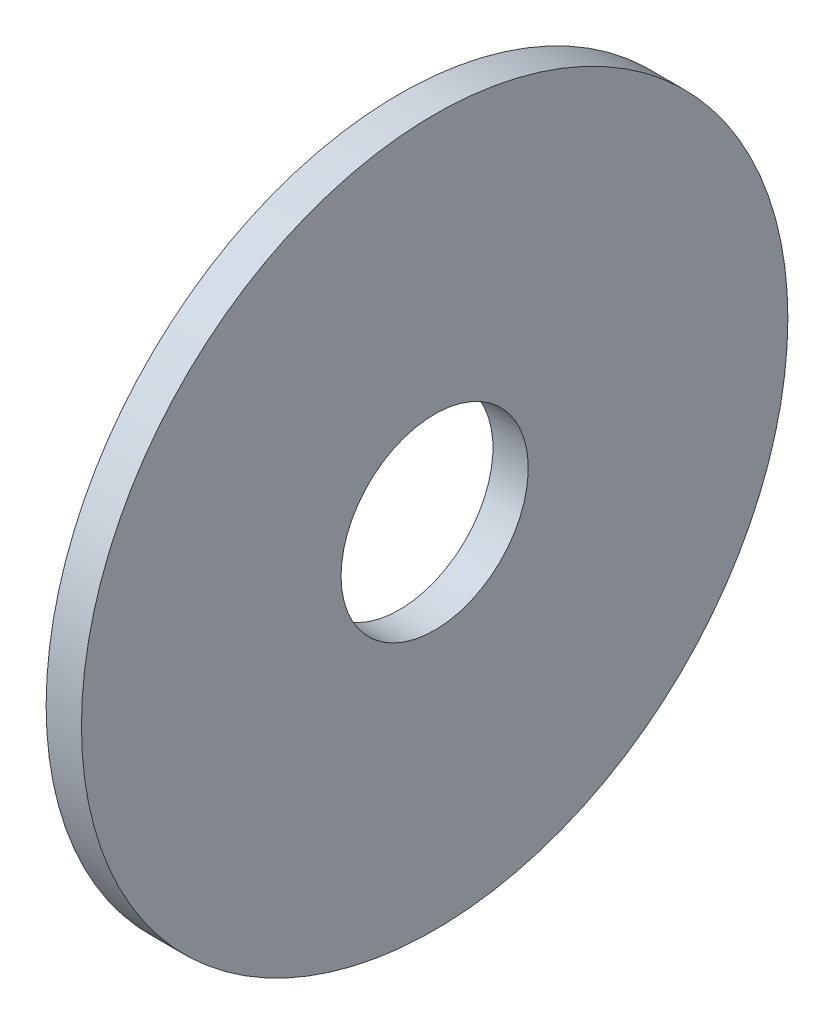
ISO-10303-21;
HEADER;
FILE_DESCRIPTION(('STEP AP214'),'2;1');
FILE_NAME('part.step','',(''),(''),'','','');
FILE_SCHEMA(('AUTOMOTIVE_DESIGN { 1 0 10303 214 1 1 1 1 }'));
ENDSEC;
DATA;
#1=APPLICATION_CONTEXT('core data for automotive mechanical design processes');
#2=APPLICATION_PROTOCOL_DEFINITION('international standard','automotive_design',2000,#1);
#3=PRODUCT_CONTEXT('',#1,'mechanical');
#4=PRODUCT('Part','Part','',(#3));
#5=PRODUCT_RELATED_PRODUCT_CATEGORY('part','',(#4));
#6=PRODUCT_DEFINITION_FORMATION('','',#4);
#7=PRODUCT_DEFINITION_CONTEXT('part definition',#1,'design');
#8=PRODUCT_DEFINITION('design','',#6,#7);
#9=PRODUCT_DEFINITION_SHAPE('','',#8);
#10=(LENGTH_UNIT() NAMED_UNIT(*) SI_UNIT(.MILLI.,.METRE.));
#11=(NAMED_UNIT(*) PLANE_ANGLE_UNIT() SI_UNIT($,.RADIAN.));
#12=(NAMED_UNIT(*) SI_UNIT($,.STERADIAN.) SOLID_ANGLE_UNIT());
#13=UNCERTAINTY_MEASURE_WITH_UNIT(LENGTH_MEASURE(1.E-05),#10,'distance_accuracy_value','');
#14=(GEOMETRIC_REPRESENTATION_CONTEXT(3) GLOBAL_UNCERTAINTY_ASSIGNED_CONTEXT((#13)) GLOBAL_UNIT_ASSIGNED_CONTEXT((#10,
#11,#12)) REPRESENTATION_CONTEXT('',''));
#15=CARTESIAN_POINT('',(0.,0.,0.));
#16=DIRECTION('',(0.,0.,1.));
#17=DIRECTION('',(1.,0.,0.));
#18=AXIS2_PLACEMENT_3D('',#15,#16,#17);
#19=CARTESIAN_POINT('',(0.,0.,-10.));
#20=DIRECTION('',(1.,0.,0.));
#21=DIRECTION('',(0.,0.,-1.));
#22=AXIS2_PLACEMENT_3D('',#19,#20,#21);
#23=PLANE('',#22);
#24=CARTESIAN_POINT('',(0.,0.,0.));
#25=DIRECTION('',(-1.,0.,0.));
#26=DIRECTION('',(0.,0.,1.));
#27=AXIS2_PLACEMENT_3D('',#24,#25,#26);
#28=CIRCLE('',#27,2.65);
#29=CARTESIAN_POINT('',(0.,0.,2.65));
#30=VERTEX_POINT('',#29);
#31=EDGE_CURVE('E10',#30,#30,#28,.T.);
#32=ORIENTED_EDGE('',*,*,#31,.F.);
#33=EDGE_LOOP('',(#32));
#34=FACE_BOUND('',#33,.T.);
#35=CARTESIAN_POINT('',(0.,0.,0.));
#36=DIRECTION('',(-1.,0.,0.));
#37=DIRECTION('',(0.,0.,1.));
#38=AXIS2_PLACEMENT_3D('',#35,#36,#37);
#39=CIRCLE('',#38,10.);
#40=CARTESIAN_POINT('',(0.,0.,10.));
#41=VERTEX_POINT('',#40);
#42=EDGE_CURVE('E48',#41,#41,#39,.T.);
#43=ORIENTED_EDGE('',*,*,#42,.T.);
#44=EDGE_LOOP('',(#43));
#45=FACE_BOUND('',#44,.T.);
#46=ADVANCED_FACE('F34',(#34,#45),#23,.F.);
#47=CARTESIAN_POINT('',(0.,0.,0.));
#48=DIRECTION('',(-1.,0.,0.));
#49=DIRECTION('',(0.,0.,1.));
#50=AXIS2_PLACEMENT_3D('',#47,#48,#49);
#51=CYLINDRICAL_SURFACE('',#50,2.65);
#52=CARTESIAN_POINT('',(1.,0.,0.));
#53=DIRECTION('',(-1.,0.,0.));
#54=DIRECTION('',(0.,0.,1.));
#55=AXIS2_PLACEMENT_3D('',#52,#53,#54);
#56=CIRCLE('',#55,2.65);
#57=CARTESIAN_POINT('',(1.,0.,2.65));
#58=VERTEX_POINT('',#57);
#59=EDGE_CURVE('E40',#58,#58,#56,.T.);
#60=ORIENTED_EDGE('',*,*,#59,.F.);
#61=EDGE_LOOP('',(#60));
#62=FACE_BOUND('',#61,.T.);
#63=ORIENTED_EDGE('',*,*,#31,.T.);
#64=EDGE_LOOP('',(#63));
#65=FACE_BOUND('',#64,.T.);
#66=ADVANCED_FACE('F63',(#62,#65),#51,.F.);
#67=CARTESIAN_POINT('',(0.999999999999945,0.,-10.));
#68=DIRECTION('',(-1.,0.,0.));
#69=DIRECTION('',(0.,0.,1.));
#70=AXIS2_PLACEMENT_3D('',#67,#68,#69);
#71=PLANE('',#70);
#72=CARTESIAN_POINT('',(1.,0.,0.));
#73=DIRECTION('',(-1.,0.,0.));
#74=DIRECTION('',(0.,0.,1.));
#75=AXIS2_PLACEMENT_3D('',#72,#73,#74);
#76=CIRCLE('',#75,10.);
#77=CARTESIAN_POINT('',(1.,0.,10.));
#78=VERTEX_POINT('',#77);
#79=EDGE_CURVE('E44',#78,#78,#76,.T.);
#80=ORIENTED_EDGE('',*,*,#79,.F.);
#81=EDGE_LOOP('',(#80));
#82=FACE_BOUND('',#81,.T.);
#83=ORIENTED_EDGE('',*,*,#59,.T.);
#84=EDGE_LOOP('',(#83));
#85=FACE_BOUND('',#84,.T.);
#86=ADVANCED_FACE('F58',(#82,#85),#71,.F.);
#87=CARTESIAN_POINT('',(0.,0.,0.));
#88=DIRECTION('',(-1.,0.,0.));
#89=DIRECTION('',(0.,0.,1.));
#90=AXIS2_PLACEMENT_3D('',#87,#88,#89);
#91=CYLINDRICAL_SURFACE('',#90,10.);
#92=ORIENTED_EDGE('',*,*,#42,.F.);
#93=EDGE_LOOP('',(#92));
#94=FACE_BOUND('',#93,.T.);
#95=ORIENTED_EDGE('',*,*,#79,.T.);
#96=EDGE_LOOP('',(#95));
#97=FACE_BOUND('',#96,.T.);
#98=ADVANCED_FACE('F55',(#94,#97),#91,.T.);
#99=CLOSED_SHELL('',(#46,#66,#86,#98));
#100=MANIFOLD_SOLID_BREP('B2',#99);
#101=ADVANCED_BREP_SHAPE_REPRESENTATION('',(#18,#100),#14);
#102=SHAPE_DEFINITION_REPRESENTATION(#9,#101);
ENDSEC;
END-ISO-10303-21;
